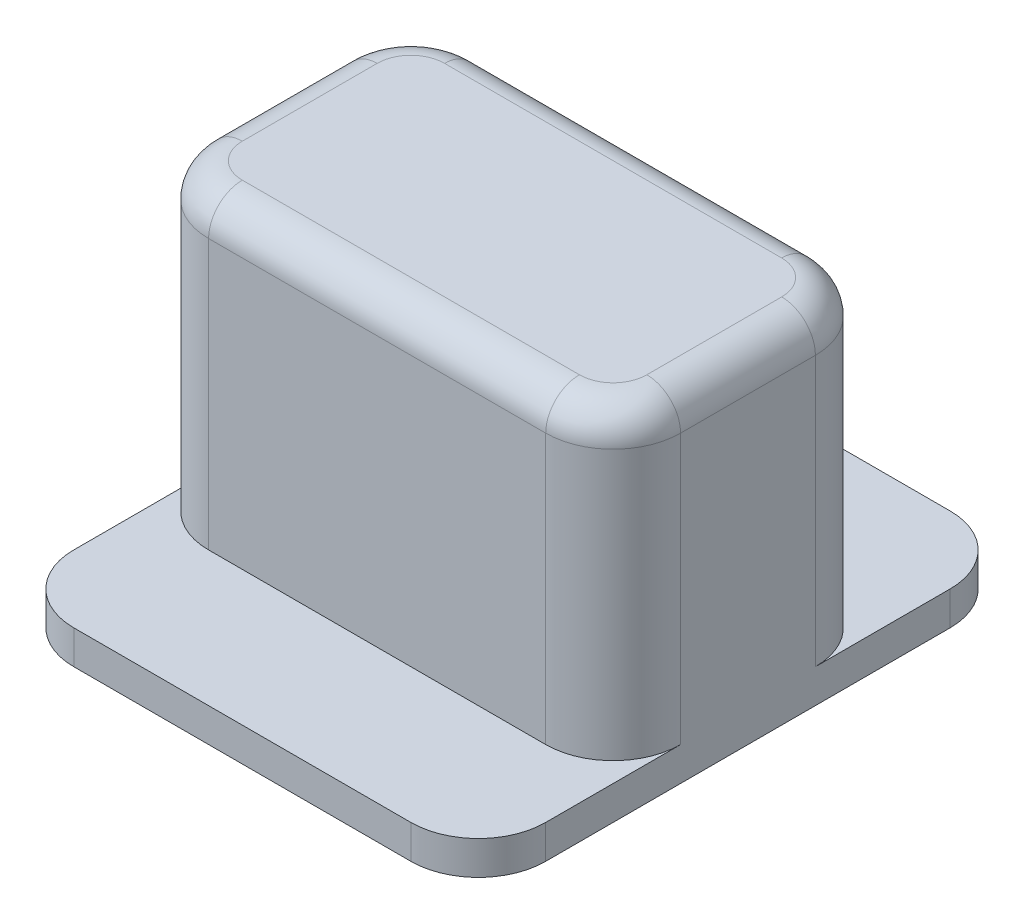
ISO-10303-21;
HEADER;
FILE_DESCRIPTION(('STEP AP214'),'2;1');
FILE_NAME('part.step','',(''),(''),'','','');
FILE_SCHEMA(('AUTOMOTIVE_DESIGN { 1 0 10303 214 1 1 1 1 }'));
ENDSEC;
DATA;
#1=APPLICATION_CONTEXT('core data for automotive mechanical design processes');
#2=APPLICATION_PROTOCOL_DEFINITION('international standard','automotive_design',2000,#1);
#3=PRODUCT_CONTEXT('',#1,'mechanical');
#4=PRODUCT('Part','Part','',(#3));
#5=PRODUCT_RELATED_PRODUCT_CATEGORY('part','',(#4));
#6=PRODUCT_DEFINITION_FORMATION('','',#4);
#7=PRODUCT_DEFINITION_CONTEXT('part definition',#1,'design');
#8=PRODUCT_DEFINITION('design','',#6,#7);
#9=PRODUCT_DEFINITION_SHAPE('','',#8);
#10=(LENGTH_UNIT() NAMED_UNIT(*) SI_UNIT(.MILLI.,.METRE.));
#11=(NAMED_UNIT(*) PLANE_ANGLE_UNIT() SI_UNIT($,.RADIAN.));
#12=(NAMED_UNIT(*) SI_UNIT($,.STERADIAN.) SOLID_ANGLE_UNIT());
#13=UNCERTAINTY_MEASURE_WITH_UNIT(LENGTH_MEASURE(1.E-05),#10,'distance_accuracy_value','');
#14=(GEOMETRIC_REPRESENTATION_CONTEXT(3) GLOBAL_UNCERTAINTY_ASSIGNED_CONTEXT((#13)) GLOBAL_UNIT_ASSIGNED_CONTEXT((#10,
#11,#12)) REPRESENTATION_CONTEXT('',''));
#15=CARTESIAN_POINT('',(0.,0.,0.));
#16=DIRECTION('',(0.,0.,1.));
#17=DIRECTION('',(1.,0.,0.));
#18=AXIS2_PLACEMENT_3D('',#15,#16,#17);
#19=CARTESIAN_POINT('',(26.5529377716743,1.,-8.5));
#20=DIRECTION('',(1.,0.,0.));
#21=DIRECTION('',(0.,0.,-1.));
#22=AXIS2_PLACEMENT_3D('',#19,#20,#21);
#23=PLANE('',#22);
#24=DIRECTION('',(0.,0.,-1.));
#25=VECTOR('',#24,1.);
#26=CARTESIAN_POINT('',(26.5529377716743,0.5,-1.5));
#27=LINE('',#26,#25);
#28=CARTESIAN_POINT('',(26.5529377716743,0.5,-1.5));
#29=VERTEX_POINT('',#28);
#30=CARTESIAN_POINT('',(26.5529377716743,0.5,-7.5));
#31=VERTEX_POINT('',#30);
#32=EDGE_CURVE('E175',#29,#31,#27,.T.);
#33=ORIENTED_EDGE('',*,*,#32,.F.);
#34=DIRECTION('',(0.,-1.,0.));
#35=VECTOR('',#34,1.);
#36=CARTESIAN_POINT('',(26.5529377716743,1.,-1.5));
#37=LINE('',#36,#35);
#38=CARTESIAN_POINT('',(26.5529377716743,1.,-1.5));
#39=VERTEX_POINT('',#38);
#40=EDGE_CURVE('E186',#29,#39,#37,.F.);
#41=ORIENTED_EDGE('',*,*,#40,.T.);
#42=DIRECTION('',(0.,0.,1.));
#43=VECTOR('',#42,1.);
#44=CARTESIAN_POINT('',(26.5529377716743,1.,-8.5));
#45=LINE('',#44,#43);
#46=CARTESIAN_POINT('',(26.5529377716743,1.,-3.5));
#47=VERTEX_POINT('',#46);
#48=EDGE_CURVE('E319',#47,#39,#45,.T.);
#49=ORIENTED_EDGE('',*,*,#48,.F.);
#50=DIRECTION('',(0.,-1.,0.));
#51=VECTOR('',#50,1.);
#52=CARTESIAN_POINT('',(26.5529377716743,1.,-3.5));
#53=LINE('',#52,#51);
#54=CARTESIAN_POINT('',(26.5529377716743,5.,-3.5));
#55=VERTEX_POINT('',#54);
#56=EDGE_CURVE('E196',#47,#55,#53,.F.);
#57=ORIENTED_EDGE('',*,*,#56,.T.);
#58=DIRECTION('',(0.,0.,1.));
#59=VECTOR('',#58,1.);
#60=CARTESIAN_POINT('',(26.5529377716743,5.,-8.5));
#61=LINE('',#60,#59);
#62=CARTESIAN_POINT('',(26.5529377716743,5.,-5.5));
#63=VERTEX_POINT('',#62);
#64=EDGE_CURVE('E282',#55,#63,#61,.F.);
#65=ORIENTED_EDGE('',*,*,#64,.T.);
#66=DIRECTION('',(0.,-1.,0.));
#67=VECTOR('',#66,1.);
#68=CARTESIAN_POINT('',(26.5529377716743,1.,-5.5));
#69=LINE('',#68,#67);
#70=CARTESIAN_POINT('',(26.5529377716743,1.,-5.5));
#71=VERTEX_POINT('',#70);
#72=EDGE_CURVE('E200',#63,#71,#69,.T.);
#73=ORIENTED_EDGE('',*,*,#72,.T.);
#74=CARTESIAN_POINT('',(26.5529377716743,1.,-7.5));
#75=VERTEX_POINT('',#74);
#76=EDGE_CURVE('E324',#75,#71,#45,.T.);
#77=ORIENTED_EDGE('',*,*,#76,.F.);
#78=DIRECTION('',(0.,-1.,0.));
#79=VECTOR('',#78,1.);
#80=CARTESIAN_POINT('',(26.5529377716743,1.,-7.5));
#81=LINE('',#80,#79);
#82=EDGE_CURVE('E190',#75,#31,#81,.T.);
#83=ORIENTED_EDGE('',*,*,#82,.T.);
#84=EDGE_LOOP('',(#33,#41,#49,#57,#65,#73,#77,#83));
#85=FACE_BOUND('',#84,.T.);
#86=ADVANCED_FACE('F35',(#85),#23,.F.);
#87=CARTESIAN_POINT('',(26.5529377716743,1.,-0.5));
#88=DIRECTION('',(0.,0.,-1.));
#89=DIRECTION('',(-1.,0.,0.));
#90=AXIS2_PLACEMENT_3D('',#87,#88,#89);
#91=PLANE('',#90);
#92=DIRECTION('',(-1.,0.,0.));
#93=VECTOR('',#92,1.);
#94=CARTESIAN_POINT('',(32.5529377716743,0.5,-0.5));
#95=LINE('',#94,#93);
#96=CARTESIAN_POINT('',(32.5529377716743,0.5,-0.499999999999999));
#97=VERTEX_POINT('',#96);
#98=CARTESIAN_POINT('',(27.5529377716743,0.5,-0.5));
#99=VERTEX_POINT('',#98);
#100=EDGE_CURVE('E178',#97,#99,#95,.T.);
#101=ORIENTED_EDGE('',*,*,#100,.F.);
#102=DIRECTION('',(0.,-1.,0.));
#103=VECTOR('',#102,1.);
#104=CARTESIAN_POINT('',(32.5529377716743,1.,-0.5));
#105=LINE('',#104,#103);
#106=CARTESIAN_POINT('',(32.5529377716743,1.,-0.5));
#107=VERTEX_POINT('',#106);
#108=EDGE_CURVE('E237',#97,#107,#105,.F.);
#109=ORIENTED_EDGE('',*,*,#108,.T.);
#110=DIRECTION('',(1.,0.,0.));
#111=VECTOR('',#110,1.);
#112=CARTESIAN_POINT('',(26.5529377716743,1.,-0.5));
#113=LINE('',#112,#111);
#114=CARTESIAN_POINT('',(27.5529377716743,1.,-0.5));
#115=VERTEX_POINT('',#114);
#116=EDGE_CURVE('E327',#115,#107,#113,.T.);
#117=ORIENTED_EDGE('',*,*,#116,.F.);
#118=DIRECTION('',(0.,-1.,0.));
#119=VECTOR('',#118,1.);
#120=CARTESIAN_POINT('',(27.5529377716743,1.,-0.5));
#121=LINE('',#120,#119);
#122=EDGE_CURVE('E239',#115,#99,#121,.T.);
#123=ORIENTED_EDGE('',*,*,#122,.T.);
#124=EDGE_LOOP('',(#101,#109,#117,#123));
#125=FACE_BOUND('',#124,.T.);
#126=ADVANCED_FACE('F366',(#125),#91,.F.);
#127=CARTESIAN_POINT('',(33.5529377716743,1.,-0.5));
#128=DIRECTION('',(-1.,0.,0.));
#129=DIRECTION('',(0.,0.,1.));
#130=AXIS2_PLACEMENT_3D('',#127,#128,#129);
#131=PLANE('',#130);
#132=DIRECTION('',(0.,0.,1.));
#133=VECTOR('',#132,1.);
#134=CARTESIAN_POINT('',(33.5529377716743,0.5,-7.5));
#135=LINE('',#134,#133);
#136=CARTESIAN_POINT('',(33.5529377716743,0.5,-7.5));
#137=VERTEX_POINT('',#136);
#138=CARTESIAN_POINT('',(33.5529377716743,0.5,-1.5));
#139=VERTEX_POINT('',#138);
#140=EDGE_CURVE('E52',#137,#139,#135,.T.);
#141=ORIENTED_EDGE('',*,*,#140,.F.);
#142=DIRECTION('',(0.,-1.,0.));
#143=VECTOR('',#142,1.);
#144=CARTESIAN_POINT('',(33.5529377716743,1.,-7.5));
#145=LINE('',#144,#143);
#146=CARTESIAN_POINT('',(33.5529377716743,1.,-7.5));
#147=VERTEX_POINT('',#146);
#148=EDGE_CURVE('E230',#137,#147,#145,.F.);
#149=ORIENTED_EDGE('',*,*,#148,.T.);
#150=DIRECTION('',(0.,0.,-1.));
#151=VECTOR('',#150,1.);
#152=CARTESIAN_POINT('',(33.5529377716743,1.,-0.5));
#153=LINE('',#152,#151);
#154=CARTESIAN_POINT('',(33.5529377716743,1.,-5.5));
#155=VERTEX_POINT('',#154);
#156=EDGE_CURVE('E329',#155,#147,#153,.T.);
#157=ORIENTED_EDGE('',*,*,#156,.F.);
#158=DIRECTION('',(0.,-1.,0.));
#159=VECTOR('',#158,1.);
#160=CARTESIAN_POINT('',(33.5529377716743,1.,-5.5));
#161=LINE('',#160,#159);
#162=CARTESIAN_POINT('',(33.5529377716743,5.,-5.5));
#163=VERTEX_POINT('',#162);
#164=EDGE_CURVE('E232',#155,#163,#161,.F.);
#165=ORIENTED_EDGE('',*,*,#164,.T.);
#166=DIRECTION('',(0.,0.,-1.));
#167=VECTOR('',#166,1.);
#168=CARTESIAN_POINT('',(33.5529377716743,5.,-0.5));
#169=LINE('',#168,#167);
#170=CARTESIAN_POINT('',(33.5529377716743,5.,-3.5));
#171=VERTEX_POINT('',#170);
#172=EDGE_CURVE('E274',#163,#171,#169,.F.);
#173=ORIENTED_EDGE('',*,*,#172,.T.);
#174=DIRECTION('',(0.,-1.,0.));
#175=VECTOR('',#174,1.);
#176=CARTESIAN_POINT('',(33.5529377716743,1.,-3.5));
#177=LINE('',#176,#175);
#178=CARTESIAN_POINT('',(33.5529377716743,1.,-3.5));
#179=VERTEX_POINT('',#178);
#180=EDGE_CURVE('E235',#171,#179,#177,.T.);
#181=ORIENTED_EDGE('',*,*,#180,.T.);
#182=CARTESIAN_POINT('',(33.5529377716743,1.,-1.5));
#183=VERTEX_POINT('',#182);
#184=EDGE_CURVE('E203',#183,#179,#153,.T.);
#185=ORIENTED_EDGE('',*,*,#184,.F.);
#186=DIRECTION('',(0.,-1.,0.));
#187=VECTOR('',#186,1.);
#188=CARTESIAN_POINT('',(33.5529377716743,1.,-1.5));
#189=LINE('',#188,#187);
#190=EDGE_CURVE('E227',#183,#139,#189,.T.);
#191=ORIENTED_EDGE('',*,*,#190,.T.);
#192=EDGE_LOOP('',(#141,#149,#157,#165,#173,#181,#185,#191));
#193=FACE_BOUND('',#192,.T.);
#194=ADVANCED_FACE('F371',(#193),#131,.F.);
#195=CARTESIAN_POINT('',(33.5529377716743,1.,-8.5));
#196=DIRECTION('',(0.,0.,1.));
#197=DIRECTION('',(1.,0.,0.));
#198=AXIS2_PLACEMENT_3D('',#195,#196,#197);
#199=PLANE('',#198);
#200=DIRECTION('',(1.,0.,0.));
#201=VECTOR('',#200,1.);
#202=CARTESIAN_POINT('',(27.5529377716743,0.5,-8.5));
#203=LINE('',#202,#201);
#204=CARTESIAN_POINT('',(27.5529377716743,0.5,-8.5));
#205=VERTEX_POINT('',#204);
#206=CARTESIAN_POINT('',(32.5529377716743,0.5,-8.5));
#207=VERTEX_POINT('',#206);
#208=EDGE_CURVE('E352',#205,#207,#203,.T.);
#209=ORIENTED_EDGE('',*,*,#208,.F.);
#210=DIRECTION('',(0.,-1.,0.));
#211=VECTOR('',#210,1.);
#212=CARTESIAN_POINT('',(27.5529377716743,1.,-8.5));
#213=LINE('',#212,#211);
#214=CARTESIAN_POINT('',(27.5529377716743,1.,-8.5));
#215=VERTEX_POINT('',#214);
#216=EDGE_CURVE('E212',#205,#215,#213,.F.);
#217=ORIENTED_EDGE('',*,*,#216,.T.);
#218=DIRECTION('',(-1.,0.,0.));
#219=VECTOR('',#218,1.);
#220=CARTESIAN_POINT('',(33.5529377716743,1.,-8.5));
#221=LINE('',#220,#219);
#222=CARTESIAN_POINT('',(32.5529377716743,1.,-8.5));
#223=VERTEX_POINT('',#222);
#224=EDGE_CURVE('E197',#223,#215,#221,.T.);
#225=ORIENTED_EDGE('',*,*,#224,.F.);
#226=DIRECTION('',(0.,-1.,0.));
#227=VECTOR('',#226,1.);
#228=CARTESIAN_POINT('',(32.5529377716743,1.,-8.5));
#229=LINE('',#228,#227);
#230=EDGE_CURVE('E209',#223,#207,#229,.T.);
#231=ORIENTED_EDGE('',*,*,#230,.T.);
#232=EDGE_LOOP('',(#209,#217,#225,#231));
#233=FACE_BOUND('',#232,.T.);
#234=ADVANCED_FACE('F351',(#233),#199,.F.);
#235=CARTESIAN_POINT('',(27.5529377716743,1.,-7.5));
#236=DIRECTION('',(0.,-1.,0.));
#237=DIRECTION('',(0.,0.,-1.));
#238=AXIS2_PLACEMENT_3D('',#235,#236,#237);
#239=CYLINDRICAL_SURFACE('',#238,1.);
#240=ORIENTED_EDGE('',*,*,#216,.F.);
#241=CARTESIAN_POINT('',(27.5529377716743,0.5,-7.5));
#242=DIRECTION('',(0.,-1.,0.));
#243=DIRECTION('',(0.,0.,-1.));
#244=AXIS2_PLACEMENT_3D('',#241,#242,#243);
#245=CIRCLE('',#244,1.);
#246=EDGE_CURVE('E191',#31,#205,#245,.T.);
#247=ORIENTED_EDGE('',*,*,#246,.F.);
#248=ORIENTED_EDGE('',*,*,#82,.F.);
#249=CARTESIAN_POINT('',(27.5529377716743,1.,-7.5));
#250=DIRECTION('',(0.,1.,0.));
#251=DIRECTION('',(0.,0.,1.));
#252=AXIS2_PLACEMENT_3D('',#249,#250,#251);
#253=CIRCLE('',#252,1.);
#254=EDGE_CURVE('E216',#215,#75,#253,.T.);
#255=ORIENTED_EDGE('',*,*,#254,.F.);
#256=EDGE_LOOP('',(#240,#247,#248,#255));
#257=FACE_BOUND('',#256,.T.);
#258=ADVANCED_FACE('F356',(#257),#239,.T.);
#259=CARTESIAN_POINT('',(32.5529377716743,1.,-7.5));
#260=DIRECTION('',(0.,-1.,0.));
#261=DIRECTION('',(0.,0.,-1.));
#262=AXIS2_PLACEMENT_3D('',#259,#260,#261);
#263=CYLINDRICAL_SURFACE('',#262,1.);
#264=ORIENTED_EDGE('',*,*,#148,.F.);
#265=CARTESIAN_POINT('',(32.5529377716743,0.5,-7.5));
#266=DIRECTION('',(0.,-1.,0.));
#267=DIRECTION('',(0.,0.,-1.));
#268=AXIS2_PLACEMENT_3D('',#265,#266,#267);
#269=CIRCLE('',#268,1.);
#270=EDGE_CURVE('E348',#207,#137,#269,.T.);
#271=ORIENTED_EDGE('',*,*,#270,.F.);
#272=ORIENTED_EDGE('',*,*,#230,.F.);
#273=CARTESIAN_POINT('',(32.5529377716743,1.,-7.5));
#274=DIRECTION('',(0.,1.,0.));
#275=DIRECTION('',(0.,0.,1.));
#276=AXIS2_PLACEMENT_3D('',#273,#274,#275);
#277=CIRCLE('',#276,1.);
#278=EDGE_CURVE('E214',#147,#223,#277,.T.);
#279=ORIENTED_EDGE('',*,*,#278,.F.);
#280=EDGE_LOOP('',(#264,#271,#272,#279));
#281=FACE_BOUND('',#280,.T.);
#282=ADVANCED_FACE('F346',(#281),#263,.T.);
#283=CARTESIAN_POINT('',(27.5529377716743,1.,-1.5));
#284=DIRECTION('',(0.,-1.,0.));
#285=DIRECTION('',(0.,0.,-1.));
#286=AXIS2_PLACEMENT_3D('',#283,#284,#285);
#287=CYLINDRICAL_SURFACE('',#286,1.);
#288=ORIENTED_EDGE('',*,*,#40,.F.);
#289=CARTESIAN_POINT('',(27.5529377716743,0.5,-1.5));
#290=DIRECTION('',(0.,-1.,0.));
#291=DIRECTION('',(0.,0.,-1.));
#292=AXIS2_PLACEMENT_3D('',#289,#290,#291);
#293=CIRCLE('',#292,1.);
#294=EDGE_CURVE('E172',#99,#29,#293,.T.);
#295=ORIENTED_EDGE('',*,*,#294,.F.);
#296=ORIENTED_EDGE('',*,*,#122,.F.);
#297=CARTESIAN_POINT('',(27.5529377716743,1.,-1.5));
#298=DIRECTION('',(0.,1.,0.));
#299=DIRECTION('',(0.,0.,1.));
#300=AXIS2_PLACEMENT_3D('',#297,#298,#299);
#301=CIRCLE('',#300,1.);
#302=EDGE_CURVE('E195',#39,#115,#301,.T.);
#303=ORIENTED_EDGE('',*,*,#302,.F.);
#304=EDGE_LOOP('',(#288,#295,#296,#303));
#305=FACE_BOUND('',#304,.T.);
#306=ADVANCED_FACE('F194',(#305),#287,.T.);
#307=CARTESIAN_POINT('',(32.5529377716743,1.,-1.5));
#308=DIRECTION('',(0.,-1.,0.));
#309=DIRECTION('',(0.,0.,-1.));
#310=AXIS2_PLACEMENT_3D('',#307,#308,#309);
#311=CYLINDRICAL_SURFACE('',#310,1.);
#312=ORIENTED_EDGE('',*,*,#108,.F.);
#313=CARTESIAN_POINT('',(32.5529377716743,0.5,-1.5));
#314=DIRECTION('',(0.,-1.,0.));
#315=DIRECTION('',(0.,0.,-1.));
#316=AXIS2_PLACEMENT_3D('',#313,#314,#315);
#317=CIRCLE('',#316,1.);
#318=EDGE_CURVE('E361',#139,#97,#317,.T.);
#319=ORIENTED_EDGE('',*,*,#318,.F.);
#320=ORIENTED_EDGE('',*,*,#190,.F.);
#321=CARTESIAN_POINT('',(32.5529377716743,1.,-1.5));
#322=DIRECTION('',(0.,1.,0.));
#323=DIRECTION('',(0.,0.,1.));
#324=AXIS2_PLACEMENT_3D('',#321,#322,#323);
#325=CIRCLE('',#324,1.);
#326=EDGE_CURVE('E241',#107,#183,#325,.T.);
#327=ORIENTED_EDGE('',*,*,#326,.F.);
#328=EDGE_LOOP('',(#312,#319,#320,#327));
#329=FACE_BOUND('',#328,.T.);
#330=ADVANCED_FACE('F369',(#329),#311,.T.);
#331=CARTESIAN_POINT('',(0.,1.,0.));
#332=DIRECTION('',(0.,1.,0.));
#333=DIRECTION('',(0.,0.,1.));
#334=AXIS2_PLACEMENT_3D('',#331,#332,#333);
#335=PLANE('',#334);
#336=ORIENTED_EDGE('',*,*,#48,.T.);
#337=ORIENTED_EDGE('',*,*,#302,.T.);
#338=ORIENTED_EDGE('',*,*,#116,.T.);
#339=ORIENTED_EDGE('',*,*,#326,.T.);
#340=ORIENTED_EDGE('',*,*,#184,.T.);
#341=CARTESIAN_POINT('',(32.5529377716743,1.,-3.5));
#342=DIRECTION('',(0.,1.,0.));
#343=DIRECTION('',(0.,0.,1.));
#344=AXIS2_PLACEMENT_3D('',#341,#342,#343);
#345=CIRCLE('',#344,1.);
#346=CARTESIAN_POINT('',(32.5529377716743,1.,-2.5));
#347=VERTEX_POINT('',#346);
#348=EDGE_CURVE('E249',#179,#347,#345,.F.);
#349=ORIENTED_EDGE('',*,*,#348,.T.);
#350=DIRECTION('',(1.,0.,0.));
#351=VECTOR('',#350,1.);
#352=CARTESIAN_POINT('',(33.5529377716743,1.,-2.5));
#353=LINE('',#352,#351);
#354=CARTESIAN_POINT('',(27.5529377716743,1.,-2.5));
#355=VERTEX_POINT('',#354);
#356=EDGE_CURVE('E307',#355,#347,#353,.T.);
#357=ORIENTED_EDGE('',*,*,#356,.F.);
#358=CARTESIAN_POINT('',(27.5529377716743,1.,-3.5));
#359=DIRECTION('',(0.,1.,0.));
#360=DIRECTION('',(0.,0.,1.));
#361=AXIS2_PLACEMENT_3D('',#358,#359,#360);
#362=CIRCLE('',#361,1.);
#363=EDGE_CURVE('E246',#355,#47,#362,.F.);
#364=ORIENTED_EDGE('',*,*,#363,.T.);
#365=EDGE_LOOP('',(#336,#337,#338,#339,#340,#349,#357,#364));
#366=FACE_BOUND('',#365,.T.);
#367=ADVANCED_FACE('F370',(#366),#335,.T.);
#368=ORIENTED_EDGE('',*,*,#224,.T.);
#369=ORIENTED_EDGE('',*,*,#254,.T.);
#370=ORIENTED_EDGE('',*,*,#76,.T.);
#371=CARTESIAN_POINT('',(27.5529377716743,1.,-5.5));
#372=DIRECTION('',(0.,1.,0.));
#373=DIRECTION('',(0.,0.,1.));
#374=AXIS2_PLACEMENT_3D('',#371,#372,#373);
#375=CIRCLE('',#374,1.);
#376=CARTESIAN_POINT('',(27.5529377716743,1.,-6.5));
#377=VERTEX_POINT('',#376);
#378=EDGE_CURVE('E244',#71,#377,#375,.F.);
#379=ORIENTED_EDGE('',*,*,#378,.T.);
#380=DIRECTION('',(-1.,0.,0.));
#381=VECTOR('',#380,1.);
#382=CARTESIAN_POINT('',(26.5529377716743,1.,-6.5));
#383=LINE('',#382,#381);
#384=CARTESIAN_POINT('',(32.5529377716743,1.,-6.5));
#385=VERTEX_POINT('',#384);
#386=EDGE_CURVE('E313',#385,#377,#383,.T.);
#387=ORIENTED_EDGE('',*,*,#386,.F.);
#388=CARTESIAN_POINT('',(32.5529377716743,1.,-5.5));
#389=DIRECTION('',(0.,1.,0.));
#390=DIRECTION('',(0.,0.,1.));
#391=AXIS2_PLACEMENT_3D('',#388,#389,#390);
#392=CIRCLE('',#391,1.);
#393=EDGE_CURVE('E251',#385,#155,#392,.F.);
#394=ORIENTED_EDGE('',*,*,#393,.T.);
#395=ORIENTED_EDGE('',*,*,#156,.T.);
#396=ORIENTED_EDGE('',*,*,#278,.T.);
#397=EDGE_LOOP('',(#368,#369,#370,#379,#387,#394,#395,#396));
#398=FACE_BOUND('',#397,.T.);
#399=ADVANCED_FACE('F337',(#398),#335,.T.);
#400=CARTESIAN_POINT('',(33.5529377716743,5.5,-2.5));
#401=DIRECTION('',(0.,0.,-1.));
#402=DIRECTION('',(-1.,0.,0.));
#403=AXIS2_PLACEMENT_3D('',#400,#401,#402);
#404=PLANE('',#403);
#405=DIRECTION('',(0.,-1.,0.));
#406=VECTOR('',#405,1.);
#407=CARTESIAN_POINT('',(32.5529377716743,5.5,-2.5));
#408=LINE('',#407,#406);
#409=CARTESIAN_POINT('',(32.5529377716743,5.,-2.5));
#410=VERTEX_POINT('',#409);
#411=EDGE_CURVE('E222',#347,#410,#408,.F.);
#412=ORIENTED_EDGE('',*,*,#411,.T.);
#413=DIRECTION('',(1.,0.,0.));
#414=VECTOR('',#413,1.);
#415=CARTESIAN_POINT('',(33.5529377716743,5.,-2.5));
#416=LINE('',#415,#414);
#417=CARTESIAN_POINT('',(27.5529377716743,5.,-2.5));
#418=VERTEX_POINT('',#417);
#419=EDGE_CURVE('E278',#410,#418,#416,.F.);
#420=ORIENTED_EDGE('',*,*,#419,.T.);
#421=DIRECTION('',(0.,-1.,0.));
#422=VECTOR('',#421,1.);
#423=CARTESIAN_POINT('',(27.5529377716743,5.5,-2.5));
#424=LINE('',#423,#422);
#425=EDGE_CURVE('E225',#418,#355,#424,.T.);
#426=ORIENTED_EDGE('',*,*,#425,.T.);
#427=ORIENTED_EDGE('',*,*,#356,.T.);
#428=EDGE_LOOP('',(#412,#420,#426,#427));
#429=FACE_BOUND('',#428,.T.);
#430=ADVANCED_FACE('F392',(#429),#404,.F.);
#431=CARTESIAN_POINT('',(26.5529377716743,5.5,-6.5));
#432=DIRECTION('',(0.,0.,1.));
#433=DIRECTION('',(1.,0.,0.));
#434=AXIS2_PLACEMENT_3D('',#431,#432,#433);
#435=PLANE('',#434);
#436=DIRECTION('',(0.,-1.,0.));
#437=VECTOR('',#436,1.);
#438=CARTESIAN_POINT('',(27.5529377716743,5.5,-6.5));
#439=LINE('',#438,#437);
#440=CARTESIAN_POINT('',(27.5529377716743,5.,-6.5));
#441=VERTEX_POINT('',#440);
#442=EDGE_CURVE('E220',#377,#441,#439,.F.);
#443=ORIENTED_EDGE('',*,*,#442,.T.);
#444=DIRECTION('',(-1.,0.,0.));
#445=VECTOR('',#444,1.);
#446=CARTESIAN_POINT('',(26.5529377716743,5.,-6.5));
#447=LINE('',#446,#445);
#448=CARTESIAN_POINT('',(32.5529377716743,5.,-6.5));
#449=VERTEX_POINT('',#448);
#450=EDGE_CURVE('E11',#441,#449,#447,.F.);
#451=ORIENTED_EDGE('',*,*,#450,.T.);
#452=DIRECTION('',(0.,-1.,0.));
#453=VECTOR('',#452,1.);
#454=CARTESIAN_POINT('',(32.5529377716743,5.5,-6.5));
#455=LINE('',#454,#453);
#456=EDGE_CURVE('E218',#449,#385,#455,.T.);
#457=ORIENTED_EDGE('',*,*,#456,.T.);
#458=ORIENTED_EDGE('',*,*,#386,.T.);
#459=EDGE_LOOP('',(#443,#451,#457,#458));
#460=FACE_BOUND('',#459,.T.);
#461=ADVANCED_FACE('F404',(#460),#435,.F.);
#462=CARTESIAN_POINT('',(0.,5.5,0.));
#463=DIRECTION('',(0.,-1.,0.));
#464=DIRECTION('',(0.,0.,-1.));
#465=AXIS2_PLACEMENT_3D('',#462,#463,#464);
#466=PLANE('',#465);
#467=DIRECTION('',(0.,0.,-1.));
#468=VECTOR('',#467,1.);
#469=CARTESIAN_POINT('',(33.0529377716743,5.5,0.));
#470=LINE('',#469,#468);
#471=CARTESIAN_POINT('',(33.0529377716743,5.5,-3.5));
#472=VERTEX_POINT('',#471);
#473=CARTESIAN_POINT('',(33.0529377716743,5.5,-5.5));
#474=VERTEX_POINT('',#473);
#475=EDGE_CURVE('E266',#472,#474,#470,.T.);
#476=ORIENTED_EDGE('',*,*,#475,.T.);
#477=CARTESIAN_POINT('',(32.5529377716743,5.5,-5.5));
#478=DIRECTION('',(0.,-1.,0.));
#479=DIRECTION('',(0.,0.,-1.));
#480=AXIS2_PLACEMENT_3D('',#477,#478,#479);
#481=CIRCLE('',#480,0.5);
#482=CARTESIAN_POINT('',(32.5529377716743,5.5,-6.));
#483=VERTEX_POINT('',#482);
#484=EDGE_CURVE('E268',#474,#483,#481,.F.);
#485=ORIENTED_EDGE('',*,*,#484,.T.);
#486=DIRECTION('',(-1.,0.,0.));
#487=VECTOR('',#486,1.);
#488=CARTESIAN_POINT('',(0.,5.5,-6.));
#489=LINE('',#488,#487);
#490=CARTESIAN_POINT('',(27.5529377716743,5.5,-6.));
#491=VERTEX_POINT('',#490);
#492=EDGE_CURVE('E254',#483,#491,#489,.T.);
#493=ORIENTED_EDGE('',*,*,#492,.T.);
#494=CARTESIAN_POINT('',(27.5529377716743,5.5,-5.5));
#495=DIRECTION('',(0.,-1.,0.));
#496=DIRECTION('',(0.,0.,-1.));
#497=AXIS2_PLACEMENT_3D('',#494,#495,#496);
#498=CIRCLE('',#497,0.5);
#499=CARTESIAN_POINT('',(27.0529377716743,5.5,-5.5));
#500=VERTEX_POINT('',#499);
#501=EDGE_CURVE('E256',#491,#500,#498,.F.);
#502=ORIENTED_EDGE('',*,*,#501,.T.);
#503=DIRECTION('',(0.,0.,1.));
#504=VECTOR('',#503,1.);
#505=CARTESIAN_POINT('',(27.0529377716743,5.5,0.));
#506=LINE('',#505,#504);
#507=CARTESIAN_POINT('',(27.0529377716743,5.5,-3.5));
#508=VERTEX_POINT('',#507);
#509=EDGE_CURVE('E258',#500,#508,#506,.T.);
#510=ORIENTED_EDGE('',*,*,#509,.T.);
#511=CARTESIAN_POINT('',(27.5529377716743,5.5,-3.5));
#512=DIRECTION('',(0.,-1.,0.));
#513=DIRECTION('',(0.,0.,-1.));
#514=AXIS2_PLACEMENT_3D('',#511,#512,#513);
#515=CIRCLE('',#514,0.5);
#516=CARTESIAN_POINT('',(27.5529377716743,5.5,-3.));
#517=VERTEX_POINT('',#516);
#518=EDGE_CURVE('E260',#508,#517,#515,.F.);
#519=ORIENTED_EDGE('',*,*,#518,.T.);
#520=DIRECTION('',(1.,0.,0.));
#521=VECTOR('',#520,1.);
#522=CARTESIAN_POINT('',(0.,5.5,-3.));
#523=LINE('',#522,#521);
#524=CARTESIAN_POINT('',(32.5529377716743,5.5,-3.));
#525=VERTEX_POINT('',#524);
#526=EDGE_CURVE('E262',#517,#525,#523,.T.);
#527=ORIENTED_EDGE('',*,*,#526,.T.);
#528=CARTESIAN_POINT('',(32.5529377716743,5.5,-3.5));
#529=DIRECTION('',(0.,-1.,0.));
#530=DIRECTION('',(0.,0.,-1.));
#531=AXIS2_PLACEMENT_3D('',#528,#529,#530);
#532=CIRCLE('',#531,0.5);
#533=EDGE_CURVE('E264',#525,#472,#532,.F.);
#534=ORIENTED_EDGE('',*,*,#533,.T.);
#535=EDGE_LOOP('',(#476,#485,#493,#502,#510,#519,#527,#534));
#536=FACE_BOUND('',#535,.T.);
#537=ADVANCED_FACE('F388',(#536),#466,.F.);
#538=CARTESIAN_POINT('',(27.5529377716743,1.,-5.5));
#539=DIRECTION('',(0.,-1.,0.));
#540=DIRECTION('',(0.,0.,-1.));
#541=AXIS2_PLACEMENT_3D('',#538,#539,#540);
#542=CYLINDRICAL_SURFACE('',#541,1.);
#543=ORIENTED_EDGE('',*,*,#72,.F.);
#544=CARTESIAN_POINT('',(27.5529377716743,5.,-5.5));
#545=DIRECTION('',(0.,-1.,0.));
#546=DIRECTION('',(0.,0.,-1.));
#547=AXIS2_PLACEMENT_3D('',#544,#545,#546);
#548=CIRCLE('',#547,1.);
#549=EDGE_CURVE('E44',#63,#441,#548,.T.);
#550=ORIENTED_EDGE('',*,*,#549,.T.);
#551=ORIENTED_EDGE('',*,*,#442,.F.);
#552=ORIENTED_EDGE('',*,*,#378,.F.);
#553=EDGE_LOOP('',(#543,#550,#551,#552));
#554=FACE_BOUND('',#553,.T.);
#555=ADVANCED_FACE('F402',(#554),#542,.T.);
#556=CARTESIAN_POINT('',(27.5529377716743,5.5,-3.5));
#557=DIRECTION('',(0.,-1.,0.));
#558=DIRECTION('',(0.,0.,-1.));
#559=AXIS2_PLACEMENT_3D('',#556,#557,#558);
#560=CYLINDRICAL_SURFACE('',#559,1.);
#561=ORIENTED_EDGE('',*,*,#425,.F.);
#562=CARTESIAN_POINT('',(27.5529377716743,5.,-3.5));
#563=DIRECTION('',(0.,-1.,0.));
#564=DIRECTION('',(0.,0.,-1.));
#565=AXIS2_PLACEMENT_3D('',#562,#563,#564);
#566=CIRCLE('',#565,1.);
#567=EDGE_CURVE('E280',#418,#55,#566,.T.);
#568=ORIENTED_EDGE('',*,*,#567,.T.);
#569=ORIENTED_EDGE('',*,*,#56,.F.);
#570=ORIENTED_EDGE('',*,*,#363,.F.);
#571=EDGE_LOOP('',(#561,#568,#569,#570));
#572=FACE_BOUND('',#571,.T.);
#573=ADVANCED_FACE('F396',(#572),#560,.T.);
#574=CARTESIAN_POINT('',(32.5529377716743,1.,-3.5));
#575=DIRECTION('',(0.,-1.,0.));
#576=DIRECTION('',(0.,0.,-1.));
#577=AXIS2_PLACEMENT_3D('',#574,#575,#576);
#578=CYLINDRICAL_SURFACE('',#577,1.);
#579=ORIENTED_EDGE('',*,*,#180,.F.);
#580=CARTESIAN_POINT('',(32.5529377716743,5.,-3.5));
#581=DIRECTION('',(0.,-1.,0.));
#582=DIRECTION('',(0.,0.,-1.));
#583=AXIS2_PLACEMENT_3D('',#580,#581,#582);
#584=CIRCLE('',#583,1.);
#585=EDGE_CURVE('E276',#171,#410,#584,.T.);
#586=ORIENTED_EDGE('',*,*,#585,.T.);
#587=ORIENTED_EDGE('',*,*,#411,.F.);
#588=ORIENTED_EDGE('',*,*,#348,.F.);
#589=EDGE_LOOP('',(#579,#586,#587,#588));
#590=FACE_BOUND('',#589,.T.);
#591=ADVANCED_FACE('F376',(#590),#578,.T.);
#592=CARTESIAN_POINT('',(32.5529377716743,5.5,-5.5));
#593=DIRECTION('',(0.,-1.,0.));
#594=DIRECTION('',(0.,0.,-1.));
#595=AXIS2_PLACEMENT_3D('',#592,#593,#594);
#596=CYLINDRICAL_SURFACE('',#595,1.);
#597=ORIENTED_EDGE('',*,*,#456,.F.);
#598=CARTESIAN_POINT('',(32.5529377716743,5.,-5.5));
#599=DIRECTION('',(0.,-1.,0.));
#600=DIRECTION('',(0.,0.,-1.));
#601=AXIS2_PLACEMENT_3D('',#598,#599,#600);
#602=CIRCLE('',#601,1.);
#603=EDGE_CURVE('E271',#449,#163,#602,.T.);
#604=ORIENTED_EDGE('',*,*,#603,.T.);
#605=ORIENTED_EDGE('',*,*,#164,.F.);
#606=ORIENTED_EDGE('',*,*,#393,.F.);
#607=EDGE_LOOP('',(#597,#604,#605,#606));
#608=FACE_BOUND('',#607,.T.);
#609=ADVANCED_FACE('F410',(#608),#596,.T.);
#610=CARTESIAN_POINT('',(27.5529377716743,5.,-3.5));
#611=DIRECTION('',(0.,-1.,0.));
#612=DIRECTION('',(0.,0.,-1.));
#613=AXIS2_PLACEMENT_3D('',#610,#611,#612);
#614=DEGENERATE_TOROIDAL_SURFACE('',#613,0.5,0.5,.T.);
#615=CARTESIAN_POINT('',(27.0529377716743,5.,-3.5));
#616=DIRECTION('',(0.,0.,-1.));
#617=DIRECTION('',(-1.,0.,0.));
#618=AXIS2_PLACEMENT_3D('',#615,#616,#617);
#619=CIRCLE('',#618,0.5);
#620=EDGE_CURVE('E300',#55,#508,#619,.T.);
#621=ORIENTED_EDGE('',*,*,#620,.F.);
#622=ORIENTED_EDGE('',*,*,#567,.F.);
#623=CARTESIAN_POINT('',(27.5529377716743,5.,-3.));
#624=DIRECTION('',(1.,0.,0.));
#625=DIRECTION('',(0.,0.,-1.));
#626=AXIS2_PLACEMENT_3D('',#623,#624,#625);
#627=CIRCLE('',#626,0.5);
#628=EDGE_CURVE('E39',#517,#418,#627,.T.);
#629=ORIENTED_EDGE('',*,*,#628,.F.);
#630=ORIENTED_EDGE('',*,*,#518,.F.);
#631=EDGE_LOOP('',(#621,#622,#629,#630));
#632=FACE_BOUND('',#631,.T.);
#633=ADVANCED_FACE('F37',(#632),#614,.T.);
#634=CARTESIAN_POINT('',(0.,5.,-3.));
#635=DIRECTION('',(1.,0.,0.));
#636=DIRECTION('',(0.,0.,-1.));
#637=AXIS2_PLACEMENT_3D('',#634,#635,#636);
#638=CYLINDRICAL_SURFACE('',#637,0.5);
#639=ORIENTED_EDGE('',*,*,#628,.T.);
#640=ORIENTED_EDGE('',*,*,#419,.F.);
#641=CARTESIAN_POINT('',(32.5529377716743,5.,-3.));
#642=DIRECTION('',(1.,0.,0.));
#643=DIRECTION('',(0.,0.,-1.));
#644=AXIS2_PLACEMENT_3D('',#641,#642,#643);
#645=CIRCLE('',#644,0.5);
#646=EDGE_CURVE('E298',#525,#410,#645,.T.);
#647=ORIENTED_EDGE('',*,*,#646,.F.);
#648=ORIENTED_EDGE('',*,*,#526,.F.);
#649=EDGE_LOOP('',(#639,#640,#647,#648));
#650=FACE_BOUND('',#649,.T.);
#651=ADVANCED_FACE('F390',(#650),#638,.T.);
#652=CARTESIAN_POINT('',(27.0529377716743,5.,0.));
#653=DIRECTION('',(0.,0.,1.));
#654=DIRECTION('',(1.,0.,0.));
#655=AXIS2_PLACEMENT_3D('',#652,#653,#654);
#656=CYLINDRICAL_SURFACE('',#655,0.5);
#657=ORIENTED_EDGE('',*,*,#620,.T.);
#658=ORIENTED_EDGE('',*,*,#509,.F.);
#659=CARTESIAN_POINT('',(27.0529377716743,5.,-5.5));
#660=DIRECTION('',(0.,0.,-1.));
#661=DIRECTION('',(-1.,0.,0.));
#662=AXIS2_PLACEMENT_3D('',#659,#660,#661);
#663=CIRCLE('',#662,0.5);
#664=EDGE_CURVE('E295',#63,#500,#663,.T.);
#665=ORIENTED_EDGE('',*,*,#664,.F.);
#666=ORIENTED_EDGE('',*,*,#64,.F.);
#667=EDGE_LOOP('',(#657,#658,#665,#666));
#668=FACE_BOUND('',#667,.T.);
#669=ADVANCED_FACE('F400',(#668),#656,.T.);
#670=CARTESIAN_POINT('',(32.5529377716743,5.,-3.5));
#671=DIRECTION('',(0.,-1.,0.));
#672=DIRECTION('',(0.,0.,-1.));
#673=AXIS2_PLACEMENT_3D('',#670,#671,#672);
#674=DEGENERATE_TOROIDAL_SURFACE('',#673,0.5,0.5,.T.);
#675=ORIENTED_EDGE('',*,*,#646,.T.);
#676=ORIENTED_EDGE('',*,*,#585,.F.);
#677=CARTESIAN_POINT('',(33.0529377716743,5.,-3.5));
#678=DIRECTION('',(0.,0.,-1.));
#679=DIRECTION('',(-1.,0.,0.));
#680=AXIS2_PLACEMENT_3D('',#677,#678,#679);
#681=CIRCLE('',#680,0.5);
#682=EDGE_CURVE('E292',#472,#171,#681,.T.);
#683=ORIENTED_EDGE('',*,*,#682,.F.);
#684=ORIENTED_EDGE('',*,*,#533,.F.);
#685=EDGE_LOOP('',(#675,#676,#683,#684));
#686=FACE_BOUND('',#685,.T.);
#687=ADVANCED_FACE('F379',(#686),#674,.T.);
#688=CARTESIAN_POINT('',(27.5529377716743,5.,-5.5));
#689=DIRECTION('',(0.,-1.,0.));
#690=DIRECTION('',(0.,0.,-1.));
#691=AXIS2_PLACEMENT_3D('',#688,#689,#690);
#692=DEGENERATE_TOROIDAL_SURFACE('',#691,0.5,0.5,.T.);
#693=ORIENTED_EDGE('',*,*,#664,.T.);
#694=ORIENTED_EDGE('',*,*,#501,.F.);
#695=CARTESIAN_POINT('',(27.5529377716743,5.,-6.));
#696=DIRECTION('',(1.,0.,0.));
#697=DIRECTION('',(0.,0.,-1.));
#698=AXIS2_PLACEMENT_3D('',#695,#696,#697);
#699=CIRCLE('',#698,0.5);
#700=EDGE_CURVE('E289',#441,#491,#699,.T.);
#701=ORIENTED_EDGE('',*,*,#700,.F.);
#702=ORIENTED_EDGE('',*,*,#549,.F.);
#703=EDGE_LOOP('',(#693,#694,#701,#702));
#704=FACE_BOUND('',#703,.T.);
#705=ADVANCED_FACE('F419',(#704),#692,.T.);
#706=CARTESIAN_POINT('',(33.0529377716743,5.,0.));
#707=DIRECTION('',(0.,0.,-1.));
#708=DIRECTION('',(-1.,0.,0.));
#709=AXIS2_PLACEMENT_3D('',#706,#707,#708);
#710=CYLINDRICAL_SURFACE('',#709,0.5);
#711=ORIENTED_EDGE('',*,*,#682,.T.);
#712=ORIENTED_EDGE('',*,*,#172,.F.);
#713=CARTESIAN_POINT('',(33.0529377716743,5.,-5.5));
#714=DIRECTION('',(0.,0.,-1.));
#715=DIRECTION('',(-1.,0.,0.));
#716=AXIS2_PLACEMENT_3D('',#713,#714,#715);
#717=CIRCLE('',#716,0.5);
#718=EDGE_CURVE('E287',#474,#163,#717,.T.);
#719=ORIENTED_EDGE('',*,*,#718,.F.);
#720=ORIENTED_EDGE('',*,*,#475,.F.);
#721=EDGE_LOOP('',(#711,#712,#719,#720));
#722=FACE_BOUND('',#721,.T.);
#723=ADVANCED_FACE('F384',(#722),#710,.T.);
#724=CARTESIAN_POINT('',(0.,5.,-6.));
#725=DIRECTION('',(-1.,0.,0.));
#726=DIRECTION('',(0.,0.,1.));
#727=AXIS2_PLACEMENT_3D('',#724,#725,#726);
#728=CYLINDRICAL_SURFACE('',#727,0.5);
#729=ORIENTED_EDGE('',*,*,#700,.T.);
#730=ORIENTED_EDGE('',*,*,#492,.F.);
#731=CARTESIAN_POINT('',(32.5529377716743,5.,-6.));
#732=DIRECTION('',(1.,0.,0.));
#733=DIRECTION('',(0.,0.,-1.));
#734=AXIS2_PLACEMENT_3D('',#731,#732,#733);
#735=CIRCLE('',#734,0.5);
#736=EDGE_CURVE('E285',#449,#483,#735,.T.);
#737=ORIENTED_EDGE('',*,*,#736,.F.);
#738=ORIENTED_EDGE('',*,*,#450,.F.);
#739=EDGE_LOOP('',(#729,#730,#737,#738));
#740=FACE_BOUND('',#739,.T.);
#741=ADVANCED_FACE('F416',(#740),#728,.T.);
#742=CARTESIAN_POINT('',(32.5529377716743,5.,-5.5));
#743=DIRECTION('',(0.,-1.,0.));
#744=DIRECTION('',(0.,0.,-1.));
#745=AXIS2_PLACEMENT_3D('',#742,#743,#744);
#746=DEGENERATE_TOROIDAL_SURFACE('',#745,0.5,0.5,.T.);
#747=ORIENTED_EDGE('',*,*,#718,.T.);
#748=ORIENTED_EDGE('',*,*,#603,.F.);
#749=ORIENTED_EDGE('',*,*,#736,.T.);
#750=ORIENTED_EDGE('',*,*,#484,.F.);
#751=EDGE_LOOP('',(#747,#748,#749,#750));
#752=FACE_BOUND('',#751,.T.);
#753=ADVANCED_FACE('F413',(#752),#746,.T.);
#754=CARTESIAN_POINT('',(27.5529377716743,0.5,-1.5));
#755=DIRECTION('',(0.,-1.,0.));
#756=DIRECTION('',(0.,0.,-1.));
#757=AXIS2_PLACEMENT_3D('',#754,#755,#756);
#758=PLANE('',#757);
#759=ORIENTED_EDGE('',*,*,#294,.T.);
#760=ORIENTED_EDGE('',*,*,#32,.T.);
#761=ORIENTED_EDGE('',*,*,#246,.T.);
#762=ORIENTED_EDGE('',*,*,#208,.T.);
#763=ORIENTED_EDGE('',*,*,#270,.T.);
#764=ORIENTED_EDGE('',*,*,#140,.T.);
#765=ORIENTED_EDGE('',*,*,#318,.T.);
#766=ORIENTED_EDGE('',*,*,#100,.T.);
#767=EDGE_LOOP('',(#759,#760,#761,#762,#763,#764,#765,#766));
#768=FACE_BOUND('',#767,.T.);
#769=ADVANCED_FACE('F174',(#768),#758,.T.);
#770=CLOSED_SHELL('',(#86,#126,#194,#234,#258,#282,#306,#330,#367,#399,#430,#461,#537,#555,#573,
#591,#609,#633,#651,#669,#687,#705,#723,#741,#753,#769));
#771=MANIFOLD_SOLID_BREP('B2',#770);
#772=ADVANCED_BREP_SHAPE_REPRESENTATION('',(#18,#771),#14);
#773=SHAPE_DEFINITION_REPRESENTATION(#9,#772);
ENDSEC;
END-ISO-10303-21;
